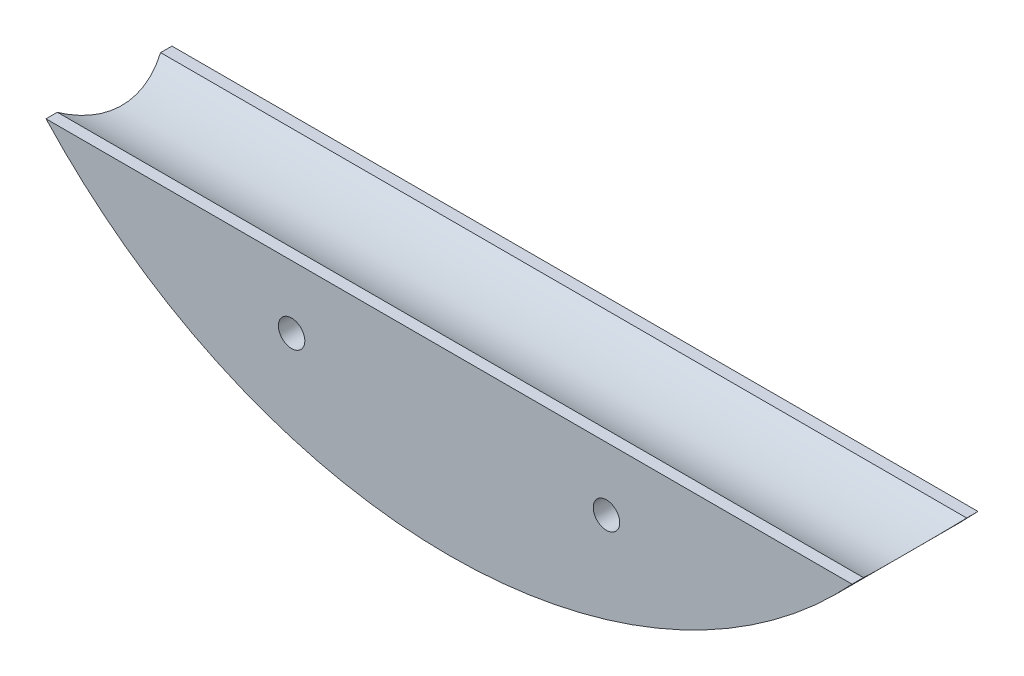
ISO-10303-21;
HEADER;
FILE_DESCRIPTION(('STEP AP214'),'2;1');
FILE_NAME('part.step','',(''),(''),'','','');
FILE_SCHEMA(('AUTOMOTIVE_DESIGN { 1 0 10303 214 1 1 1 1 }'));
ENDSEC;
DATA;
#1=APPLICATION_CONTEXT('core data for automotive mechanical design processes');
#2=APPLICATION_PROTOCOL_DEFINITION('international standard','automotive_design',2000,#1);
#3=PRODUCT_CONTEXT('',#1,'mechanical');
#4=PRODUCT('Part','Part','',(#3));
#5=PRODUCT_RELATED_PRODUCT_CATEGORY('part','',(#4));
#6=PRODUCT_DEFINITION_FORMATION('','',#4);
#7=PRODUCT_DEFINITION_CONTEXT('part definition',#1,'design');
#8=PRODUCT_DEFINITION('design','',#6,#7);
#9=PRODUCT_DEFINITION_SHAPE('','',#8);
#10=(LENGTH_UNIT() NAMED_UNIT(*) SI_UNIT(.MILLI.,.METRE.));
#11=(NAMED_UNIT(*) PLANE_ANGLE_UNIT() SI_UNIT($,.RADIAN.));
#12=(NAMED_UNIT(*) SI_UNIT($,.STERADIAN.) SOLID_ANGLE_UNIT());
#13=UNCERTAINTY_MEASURE_WITH_UNIT(LENGTH_MEASURE(1.E-05),#10,'distance_accuracy_value','');
#14=(GEOMETRIC_REPRESENTATION_CONTEXT(3) GLOBAL_UNCERTAINTY_ASSIGNED_CONTEXT((#13)) GLOBAL_UNIT_ASSIGNED_CONTEXT((#10,
#11,#12)) REPRESENTATION_CONTEXT('',''));
#15=CARTESIAN_POINT('',(0.,0.,0.));
#16=DIRECTION('',(0.,0.,1.));
#17=DIRECTION('',(1.,0.,0.));
#18=AXIS2_PLACEMENT_3D('',#15,#16,#17);
#19=CARTESIAN_POINT('',(64.,59.,20.));
#20=DIRECTION('',(0.,0.,-1.));
#21=DIRECTION('',(-1.,0.,0.));
#22=AXIS2_PLACEMENT_3D('',#19,#20,#21);
#23=CYLINDRICAL_SURFACE('',#22,87.0459648691426);
#24=CARTESIAN_POINT('',(0.,0.,1.8));
#25=CARTESIAN_POINT('',(0.156849847581585,-0.170148201232293,2.10293015375695));
#26=CARTESIAN_POINT('',(0.307575116178051,-0.332278603276712,2.41370299209889));
#27=CARTESIAN_POINT('',(0.594770140164158,-0.639088365838214,3.05052681012369));
#28=CARTESIAN_POINT('',(0.731225185314643,-0.783749741981995,3.37659306305476));
#29=CARTESIAN_POINT('',(0.988535473475771,-1.05489659128155,4.04555174571464));
#30=CARTESIAN_POINT('',(1.10926191352419,-1.18123284826217,4.38855480024377));
#31=CARTESIAN_POINT('',(1.33150450644366,-1.41262629389724,5.08763786238525));
#32=CARTESIAN_POINT('',(1.43302632272052,-1.51768975650194,5.44371397767483));
#33=CARTESIAN_POINT('',(1.61523773971179,-1.70550805411031,6.16961508941821));
#34=CARTESIAN_POINT('',(1.69578598437329,-1.7881116728615,6.53951508948468));
#35=CARTESIAN_POINT('',(1.83309751811897,-1.92853122322813,7.28840094737878));
#36=CARTESIAN_POINT('',(1.88985918403202,-1.98634546324866,7.66738742339297));
#37=CARTESIAN_POINT('',(1.97776724088683,-2.07574459950869,8.42961784362853));
#38=CARTESIAN_POINT('',(2.00903009221981,-2.10744875451786,8.8128342362179));
#39=CARTESIAN_POINT('',(2.04542399709698,-2.14434734276286,9.58175681973212));
#40=CARTESIAN_POINT('',(2.05055829536078,-2.14954506764432,9.96746269554902));
#41=CARTESIAN_POINT('',(2.03535836118476,-2.13414134412317,10.6990406702699));
#42=CARTESIAN_POINT('',(2.01752962844299,-2.11607795536407,11.0450237743654));
#43=CARTESIAN_POINT('',(1.96106533231542,-2.0587602565504,11.7334963947131));
#44=CARTESIAN_POINT('',(1.92243079163436,-2.01950698807933,12.0759860818402));
#45=CARTESIAN_POINT('',(1.82509108497648,-1.92032112439916,12.7563833675827));
#46=CARTESIAN_POINT('',(1.76631093411515,-1.86031126233418,13.0942688718453));
#47=CARTESIAN_POINT('',(1.63002629733175,-1.72063800469842,13.7620687184618));
#48=CARTESIAN_POINT('',(1.5525219394031,-1.64097474347266,14.0919831152871));
#49=CARTESIAN_POINT('',(1.37622558243041,-1.45890897587216,14.7577498120538));
#50=CARTESIAN_POINT('',(1.2765921058093,-1.35560044704503,15.0931302701768));
#51=CARTESIAN_POINT('',(1.06039336506476,-1.13011148368297,15.7519450853594));
#52=CARTESIAN_POINT('',(0.94382320493452,-1.00792559148589,16.0753759540406));
#53=CARTESIAN_POINT('',(0.696593529175585,-0.747056430435135,16.7069983666025));
#54=CARTESIAN_POINT('',(0.566035090907,-0.608490854063347,17.0152784991133));
#55=CARTESIAN_POINT('',(0.292149517274727,-0.315681536288306,17.6180477740715));
#56=CARTESIAN_POINT('',(0.148834031959983,-0.16145208173827,17.9125491321029));
#57=CARTESIAN_POINT('',(0.,0.,18.2));
#58=B_SPLINE_CURVE_WITH_KNOTS('',3,(#24,#25,#26,#27,#28,#29,#30,#31,#32,#33,#34,#35,#36,#37,#38,
#39,#40,#41,#42,#43,#44,#45,#46,#47,#48,#49,#50,#51,#52,#53,#54,#55,#56,#57),.UNSPECIFIED.,.F.,
.F.,(4,2,2,2,2,2,2,2,2,2,2,2,2,2,2,2,4),(0.,1.14360764529249,2.28838277562444,3.44201108405324,
4.5952986575927,5.75616885677275,6.91711825962054,8.07273510460575,9.22820843823256,
10.26766214184,11.3070647560007,12.3503789676397,13.3936860476778,14.4869394195894,
15.5805094571031,16.6666516230211,17.7518118786436),.UNSPECIFIED.);
#59=CARTESIAN_POINT('',(0.,0.,1.8));
#60=VERTEX_POINT('',#59);
#61=CARTESIAN_POINT('',(0.,0.,18.2));
#62=VERTEX_POINT('',#61);
#63=EDGE_CURVE('E80',#60,#62,#58,.T.);
#64=ORIENTED_EDGE('',*,*,#63,.F.);
#65=DIRECTION('',(0.,0.,-1.));
#66=VECTOR('',#65,1.);
#67=CARTESIAN_POINT('',(0.,0.,20.));
#68=LINE('',#67,#66);
#69=CARTESIAN_POINT('',(0.,0.,0.));
#70=VERTEX_POINT('',#69);
#71=EDGE_CURVE('E72',#60,#70,#68,.T.);
#72=ORIENTED_EDGE('',*,*,#71,.T.);
#73=CARTESIAN_POINT('',(64.,59.,0.));
#74=DIRECTION('',(0.,0.,1.));
#75=DIRECTION('',(1.,0.,0.));
#76=AXIS2_PLACEMENT_3D('',#73,#74,#75);
#77=CIRCLE('',#76,87.0459648691426);
#78=CARTESIAN_POINT('',(128.,0.,0.));
#79=VERTEX_POINT('',#78);
#80=EDGE_CURVE('E76',#70,#79,#77,.T.);
#81=ORIENTED_EDGE('',*,*,#80,.T.);
#82=DIRECTION('',(0.,0.,-1.));
#83=VECTOR('',#82,1.);
#84=CARTESIAN_POINT('',(128.,0.,20.));
#85=LINE('',#84,#83);
#86=CARTESIAN_POINT('',(128.,0.,1.8));
#87=VERTEX_POINT('',#86);
#88=EDGE_CURVE('E87',#87,#79,#85,.T.);
#89=ORIENTED_EDGE('',*,*,#88,.F.);
#90=CARTESIAN_POINT('',(128.,0.,18.2));
#91=CARTESIAN_POINT('',(127.843150152418,-0.170148201232264,17.8970698462431));
#92=CARTESIAN_POINT('',(127.692424883822,-0.332278603276683,17.5862970079012));
#93=CARTESIAN_POINT('',(127.405229859836,-0.639088365838188,16.9494731898764));
#94=CARTESIAN_POINT('',(127.268774814685,-0.783749741981971,16.6234069369453));
#95=CARTESIAN_POINT('',(127.011464526524,-1.05489659128153,15.9544482542854));
#96=CARTESIAN_POINT('',(126.890738086476,-1.18123284826215,15.6114451997563));
#97=CARTESIAN_POINT('',(126.668495493556,-1.41262629389723,14.9123621376148));
#98=CARTESIAN_POINT('',(126.566973677279,-1.51768975650192,14.5562860223252));
#99=CARTESIAN_POINT('',(126.384762260288,-1.7055080541103,13.8303849105819));
#100=CARTESIAN_POINT('',(126.304214015627,-1.78811167286149,13.4604849105154));
#101=CARTESIAN_POINT('',(126.166902481881,-1.92853122322812,12.7115990526213));
#102=CARTESIAN_POINT('',(126.110140815968,-1.98634546324866,12.3326125766071));
#103=CARTESIAN_POINT('',(126.022232759113,-2.07574459950868,11.5703821563715));
#104=CARTESIAN_POINT('',(125.99096990778,-2.10744875451786,11.1871657637822));
#105=CARTESIAN_POINT('',(125.954576002903,-2.14434734276286,10.4182431802679));
#106=CARTESIAN_POINT('',(125.949441704639,-2.14954506764432,10.032537304451));
#107=CARTESIAN_POINT('',(125.964641638815,-2.13414134412318,9.3009593297302));
#108=CARTESIAN_POINT('',(125.982470371557,-2.11607795536407,8.95497622563467));
#109=CARTESIAN_POINT('',(126.038934667685,-2.05876025655041,8.26650360528699));
#110=CARTESIAN_POINT('',(126.077569208366,-2.01950698807934,7.92401391815981));
#111=CARTESIAN_POINT('',(126.174908915024,-1.92032112439917,7.24361663241737));
#112=CARTESIAN_POINT('',(126.233689065885,-1.8603112623342,6.90573112815478));
#113=CARTESIAN_POINT('',(126.369973702668,-1.72063800469843,6.23793128153823));
#114=CARTESIAN_POINT('',(126.447478060597,-1.64097474347267,5.90801688471297));
#115=CARTESIAN_POINT('',(126.62377441757,-1.45890897587217,5.24225018794625));
#116=CARTESIAN_POINT('',(126.723407894191,-1.35560044704504,4.90686972982325));
#117=CARTESIAN_POINT('',(126.939606634935,-1.13011148368299,4.24805491464059));
#118=CARTESIAN_POINT('',(127.056176795065,-1.00792559148591,3.92462404595945));
#119=CARTESIAN_POINT('',(127.303406470824,-0.747056430435146,3.29300163339751));
#120=CARTESIAN_POINT('',(127.433964909093,-0.608490854063354,2.98472150088673));
#121=CARTESIAN_POINT('',(127.707850482725,-0.315681536288308,2.38195222592848));
#122=CARTESIAN_POINT('',(127.85116596804,-0.16145208173827,2.08745086789715));
#123=CARTESIAN_POINT('',(128.,0.,1.8));
#124=B_SPLINE_CURVE_WITH_KNOTS('',3,(#90,#91,#92,#93,#94,#95,#96,#97,#98,#99,#100,#101,#102,
#103,#104,#105,#106,#107,#108,#109,#110,#111,#112,#113,#114,#115,#116,#117,#118,#119,#120,#121,
#122,#123),.UNSPECIFIED.,.F.,.F.,(4,2,2,2,2,2,2,2,2,2,2,2,2,2,2,2,4),(0.,1.14360764529248,
2.28838277562443,3.44201108405324,4.59529865759268,5.75616885677274,6.91711825962053,
8.07273510460574,9.22820843823255,10.26766214184,11.3070647560007,12.3503789676397,
13.3936860476778,14.4869394195894,15.5805094571031,16.6666516230211,17.7518118786436),.UNSPECIFIED.);
#125=CARTESIAN_POINT('',(128.,0.,18.2));
#126=VERTEX_POINT('',#125);
#127=EDGE_CURVE('E50',#126,#87,#124,.T.);
#128=ORIENTED_EDGE('',*,*,#127,.F.);
#129=CARTESIAN_POINT('',(128.,0.,20.));
#130=VERTEX_POINT('',#129);
#131=EDGE_CURVE('E97',#130,#126,#85,.T.);
#132=ORIENTED_EDGE('',*,*,#131,.F.);
#133=CARTESIAN_POINT('',(64.,59.,20.));
#134=DIRECTION('',(0.,0.,1.));
#135=DIRECTION('',(1.,0.,0.));
#136=AXIS2_PLACEMENT_3D('',#133,#134,#135);
#137=CIRCLE('',#136,87.0459648691426);
#138=CARTESIAN_POINT('',(0.,0.,20.));
#139=VERTEX_POINT('',#138);
#140=EDGE_CURVE('E89',#139,#130,#137,.T.);
#141=ORIENTED_EDGE('',*,*,#140,.F.);
#142=EDGE_CURVE('E82',#139,#62,#68,.T.);
#143=ORIENTED_EDGE('',*,*,#142,.T.);
#144=EDGE_LOOP('',(#64,#72,#81,#89,#128,#132,#141,#143));
#145=FACE_BOUND('',#144,.T.);
#146=ADVANCED_FACE('F36',(#145),#23,.T.);
#147=CARTESIAN_POINT('',(0.,0.,20.));
#148=DIRECTION('',(0.,-1.,0.));
#149=DIRECTION('',(0.,0.,-1.));
#150=AXIS2_PLACEMENT_3D('',#147,#148,#149);
#151=PLANE('',#150);
#152=DIRECTION('',(-1.,0.,0.));
#153=VECTOR('',#152,1.);
#154=CARTESIAN_POINT('',(128.,0.,18.2));
#155=LINE('',#154,#153);
#156=EDGE_CURVE('E11',#62,#126,#155,.F.);
#157=ORIENTED_EDGE('',*,*,#156,.F.);
#158=ORIENTED_EDGE('',*,*,#142,.F.);
#159=DIRECTION('',(-1.,0.,0.));
#160=VECTOR('',#159,1.);
#161=CARTESIAN_POINT('',(0.,0.,20.));
#162=LINE('',#161,#160);
#163=EDGE_CURVE('E58',#130,#139,#162,.T.);
#164=ORIENTED_EDGE('',*,*,#163,.F.);
#165=ORIENTED_EDGE('',*,*,#131,.T.);
#166=EDGE_LOOP('',(#157,#158,#164,#165));
#167=FACE_BOUND('',#166,.T.);
#168=ADVANCED_FACE('F108',(#167),#151,.F.);
#169=DIRECTION('',(-1.,0.,0.));
#170=VECTOR('',#169,1.);
#171=CARTESIAN_POINT('',(128.,0.,1.8));
#172=LINE('',#171,#170);
#173=EDGE_CURVE('E44',#87,#60,#172,.T.);
#174=ORIENTED_EDGE('',*,*,#173,.F.);
#175=ORIENTED_EDGE('',*,*,#88,.T.);
#176=DIRECTION('',(-1.,0.,0.));
#177=VECTOR('',#176,1.);
#178=CARTESIAN_POINT('',(0.,0.,0.));
#179=LINE('',#178,#177);
#180=EDGE_CURVE('E85',#79,#70,#179,.T.);
#181=ORIENTED_EDGE('',*,*,#180,.T.);
#182=ORIENTED_EDGE('',*,*,#71,.F.);
#183=EDGE_LOOP('',(#174,#175,#181,#182));
#184=FACE_BOUND('',#183,.T.);
#185=ADVANCED_FACE('F86',(#184),#151,.F.);
#186=CARTESIAN_POINT('',(64.,59.,20.));
#187=DIRECTION('',(0.,0.,1.));
#188=DIRECTION('',(1.,0.,0.));
#189=AXIS2_PLACEMENT_3D('',#186,#187,#188);
#190=PLANE('',#189);
#191=CARTESIAN_POINT('',(89.,-10.,20.));
#192=DIRECTION('',(0.,0.,1.));
#193=DIRECTION('',(1.,0.,0.));
#194=AXIS2_PLACEMENT_3D('',#191,#192,#193);
#195=CIRCLE('',#194,2.1);
#196=CARTESIAN_POINT('',(91.1,-10.,20.));
#197=VERTEX_POINT('',#196);
#198=EDGE_CURVE('E227',#197,#197,#195,.T.);
#199=ORIENTED_EDGE('',*,*,#198,.F.);
#200=EDGE_LOOP('',(#199));
#201=FACE_BOUND('',#200,.T.);
#202=CARTESIAN_POINT('',(39.,-10.,20.));
#203=DIRECTION('',(0.,0.,1.));
#204=DIRECTION('',(1.,0.,0.));
#205=AXIS2_PLACEMENT_3D('',#202,#203,#204);
#206=CIRCLE('',#205,2.09999999999999);
#207=CARTESIAN_POINT('',(41.1,-10.,20.));
#208=VERTEX_POINT('',#207);
#209=EDGE_CURVE('E229',#208,#208,#206,.T.);
#210=ORIENTED_EDGE('',*,*,#209,.F.);
#211=EDGE_LOOP('',(#210));
#212=FACE_BOUND('',#211,.T.);
#213=ORIENTED_EDGE('',*,*,#140,.T.);
#214=ORIENTED_EDGE('',*,*,#163,.T.);
#215=EDGE_LOOP('',(#213,#214));
#216=FACE_BOUND('',#215,.T.);
#217=ADVANCED_FACE('F109',(#201,#212,#216),#190,.T.);
#218=CARTESIAN_POINT('',(64.,59.,0.));
#219=DIRECTION('',(0.,0.,1.));
#220=DIRECTION('',(1.,0.,0.));
#221=AXIS2_PLACEMENT_3D('',#218,#219,#220);
#222=PLANE('',#221);
#223=ORIENTED_EDGE('',*,*,#80,.F.);
#224=ORIENTED_EDGE('',*,*,#180,.F.);
#225=EDGE_LOOP('',(#223,#224));
#226=FACE_BOUND('',#225,.T.);
#227=ADVANCED_FACE('F91',(#226),#222,.F.);
#228=CARTESIAN_POINT('',(128.,14.6,10.));
#229=DIRECTION('',(-1.,0.,0.));
#230=DIRECTION('',(0.,0.,1.));
#231=AXIS2_PLACEMENT_3D('',#228,#229,#230);
#232=CYLINDRICAL_SURFACE('',#231,16.7451485511476);
#233=ORIENTED_EDGE('',*,*,#156,.T.);
#234=ORIENTED_EDGE('',*,*,#127,.T.);
#235=ORIENTED_EDGE('',*,*,#173,.T.);
#236=ORIENTED_EDGE('',*,*,#63,.T.);
#237=EDGE_LOOP('',(#233,#234,#235,#236));
#238=FACE_BOUND('',#237,.T.);
#239=ADVANCED_FACE('F99',(#238),#232,.F.);
#240=CARTESIAN_POINT('',(39.,-10.,10.5));
#241=DIRECTION('',(0.,0.,1.));
#242=DIRECTION('',(1.,0.,0.));
#243=AXIS2_PLACEMENT_3D('',#240,#241,#242);
#244=CONICAL_SURFACE('',#243,2.1,1.02974425867665);
#245=CARTESIAN_POINT('',(39.,-10.,9.23819270004212));
#246=VERTEX_POINT('',#245);
#247=VERTEX_LOOP('',#246);
#248=FACE_BOUND('',#247,.T.);
#249=CARTESIAN_POINT('',(39.,-10.,10.5));
#250=DIRECTION('',(0.,0.,1.));
#251=DIRECTION('',(1.,0.,0.));
#252=AXIS2_PLACEMENT_3D('',#249,#250,#251);
#253=CIRCLE('',#252,2.1);
#254=CARTESIAN_POINT('',(41.1,-10.,10.5));
#255=VERTEX_POINT('',#254);
#256=EDGE_CURVE('E105',#255,#255,#253,.T.);
#257=ORIENTED_EDGE('',*,*,#256,.T.);
#258=EDGE_LOOP('',(#257));
#259=FACE_BOUND('',#258,.T.);
#260=ADVANCED_FACE('F122',(#248,#259),#244,.F.);
#261=CARTESIAN_POINT('',(39.,-10.,20.));
#262=DIRECTION('',(0.,0.,1.));
#263=DIRECTION('',(1.,0.,0.));
#264=AXIS2_PLACEMENT_3D('',#261,#262,#263);
#265=CYLINDRICAL_SURFACE('',#264,2.09999999999999);
#266=ORIENTED_EDGE('',*,*,#256,.F.);
#267=EDGE_LOOP('',(#266));
#268=FACE_BOUND('',#267,.T.);
#269=ORIENTED_EDGE('',*,*,#209,.T.);
#270=EDGE_LOOP('',(#269));
#271=FACE_BOUND('',#270,.T.);
#272=ADVANCED_FACE('F162',(#268,#271),#265,.F.);
#273=CARTESIAN_POINT('',(89.,-10.,10.5));
#274=DIRECTION('',(0.,0.,1.));
#275=DIRECTION('',(1.,0.,0.));
#276=AXIS2_PLACEMENT_3D('',#273,#274,#275);
#277=CONICAL_SURFACE('',#276,2.1,1.02974425867666);
#278=CARTESIAN_POINT('',(89.,-10.,9.23819270004213));
#279=VERTEX_POINT('',#278);
#280=VERTEX_LOOP('',#279);
#281=FACE_BOUND('',#280,.T.);
#282=CARTESIAN_POINT('',(89.,-10.,10.5));
#283=DIRECTION('',(0.,0.,1.));
#284=DIRECTION('',(1.,0.,0.));
#285=AXIS2_PLACEMENT_3D('',#282,#283,#284);
#286=CIRCLE('',#285,2.1);
#287=CARTESIAN_POINT('',(91.1,-10.,10.5));
#288=VERTEX_POINT('',#287);
#289=EDGE_CURVE('E224',#288,#288,#286,.T.);
#290=ORIENTED_EDGE('',*,*,#289,.T.);
#291=EDGE_LOOP('',(#290));
#292=FACE_BOUND('',#291,.T.);
#293=ADVANCED_FACE('F171',(#281,#292),#277,.F.);
#294=CARTESIAN_POINT('',(89.,-10.,20.));
#295=DIRECTION('',(0.,0.,1.));
#296=DIRECTION('',(1.,0.,0.));
#297=AXIS2_PLACEMENT_3D('',#294,#295,#296);
#298=CYLINDRICAL_SURFACE('',#297,2.1);
#299=ORIENTED_EDGE('',*,*,#289,.F.);
#300=EDGE_LOOP('',(#299));
#301=FACE_BOUND('',#300,.T.);
#302=ORIENTED_EDGE('',*,*,#198,.T.);
#303=EDGE_LOOP('',(#302));
#304=FACE_BOUND('',#303,.T.);
#305=ADVANCED_FACE('F181',(#301,#304),#298,.F.);
#306=CLOSED_SHELL('',(#146,#168,#185,#217,#227,#239,#260,#272,#293,#305));
#307=MANIFOLD_SOLID_BREP('B2',#306);
#308=ADVANCED_BREP_SHAPE_REPRESENTATION('',(#18,#307),#14);
#309=SHAPE_DEFINITION_REPRESENTATION(#9,#308);
ENDSEC;
END-ISO-10303-21;
